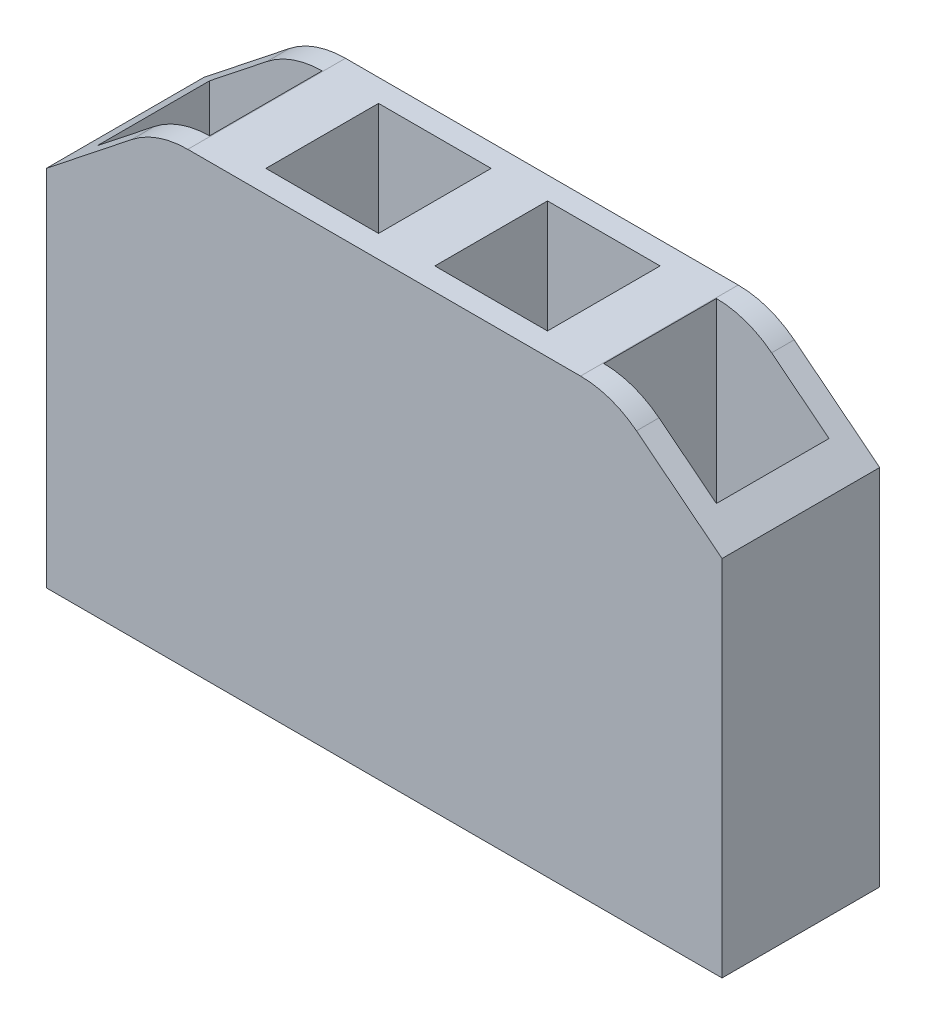
ISO-10303-21;
HEADER;
FILE_DESCRIPTION(('STEP AP214'),'2;1');
FILE_NAME('part.step','',(''),(''),'','','');
FILE_SCHEMA(('AUTOMOTIVE_DESIGN { 1 0 10303 214 1 1 1 1 }'));
ENDSEC;
DATA;
#1=APPLICATION_CONTEXT('core data for automotive mechanical design processes');
#2=APPLICATION_PROTOCOL_DEFINITION('international standard','automotive_design',2000,#1);
#3=PRODUCT_CONTEXT('',#1,'mechanical');
#4=PRODUCT('Part','Part','',(#3));
#5=PRODUCT_RELATED_PRODUCT_CATEGORY('part','',(#4));
#6=PRODUCT_DEFINITION_FORMATION('','',#4);
#7=PRODUCT_DEFINITION_CONTEXT('part definition',#1,'design');
#8=PRODUCT_DEFINITION('design','',#6,#7);
#9=PRODUCT_DEFINITION_SHAPE('','',#8);
#10=(LENGTH_UNIT() NAMED_UNIT(*) SI_UNIT(.MILLI.,.METRE.));
#11=(NAMED_UNIT(*) PLANE_ANGLE_UNIT() SI_UNIT($,.RADIAN.));
#12=(NAMED_UNIT(*) SI_UNIT($,.STERADIAN.) SOLID_ANGLE_UNIT());
#13=UNCERTAINTY_MEASURE_WITH_UNIT(LENGTH_MEASURE(1.E-05),#10,'distance_accuracy_value','');
#14=(GEOMETRIC_REPRESENTATION_CONTEXT(3) GLOBAL_UNCERTAINTY_ASSIGNED_CONTEXT((#13)) GLOBAL_UNIT_ASSIGNED_CONTEXT((#10,
#11,#12)) REPRESENTATION_CONTEXT('',''));
#15=CARTESIAN_POINT('',(0.,0.,0.));
#16=DIRECTION('',(0.,0.,1.));
#17=DIRECTION('',(1.,0.,0.));
#18=AXIS2_PLACEMENT_3D('',#15,#16,#17);
#19=CARTESIAN_POINT('',(7.5,10.,-1.75));
#20=DIRECTION('',(-1.,0.,0.));
#21=DIRECTION('',(0.,0.,1.));
#22=AXIS2_PLACEMENT_3D('',#19,#20,#21);
#23=PLANE('',#22);
#24=DIRECTION('',(0.,-1.,0.));
#25=VECTOR('',#24,1.);
#26=CARTESIAN_POINT('',(7.5,10.,-1.75));
#27=LINE('',#26,#25);
#28=CARTESIAN_POINT('',(7.5,8.06318739887953,-1.75));
#29=VERTEX_POINT('',#28);
#30=CARTESIAN_POINT('',(7.5,0.,-1.75));
#31=VERTEX_POINT('',#30);
#32=EDGE_CURVE('E371',#29,#31,#27,.T.);
#33=ORIENTED_EDGE('',*,*,#32,.F.);
#34=DIRECTION('',(0.,0.,-1.));
#35=VECTOR('',#34,1.);
#36=CARTESIAN_POINT('',(7.5,8.06318739887953,29.0804595902587));
#37=LINE('',#36,#35);
#38=CARTESIAN_POINT('',(7.5,8.06318739887953,1.75));
#39=VERTEX_POINT('',#38);
#40=EDGE_CURVE('E326',#39,#29,#37,.T.);
#41=ORIENTED_EDGE('',*,*,#40,.F.);
#42=DIRECTION('',(0.,-1.,0.));
#43=VECTOR('',#42,1.);
#44=CARTESIAN_POINT('',(7.5,10.,1.75));
#45=LINE('',#44,#43);
#46=CARTESIAN_POINT('',(7.5,0.,1.75));
#47=VERTEX_POINT('',#46);
#48=EDGE_CURVE('E355',#39,#47,#45,.T.);
#49=ORIENTED_EDGE('',*,*,#48,.T.);
#50=DIRECTION('',(0.,0.,-1.));
#51=VECTOR('',#50,1.);
#52=CARTESIAN_POINT('',(7.5,0.,-1.75));
#53=LINE('',#52,#51);
#54=EDGE_CURVE('E347',#47,#31,#53,.T.);
#55=ORIENTED_EDGE('',*,*,#54,.T.);
#56=EDGE_LOOP('',(#33,#41,#49,#55));
#57=FACE_BOUND('',#56,.T.);
#58=ADVANCED_FACE('F32',(#57),#23,.F.);
#59=CARTESIAN_POINT('',(-7.5,10.,-1.75));
#60=DIRECTION('',(0.,0.,1.));
#61=DIRECTION('',(1.,0.,0.));
#62=AXIS2_PLACEMENT_3D('',#59,#60,#61);
#63=PLANE('',#62);
#64=DIRECTION('',(-1.,0.,0.));
#65=VECTOR('',#64,1.);
#66=CARTESIAN_POINT('',(-7.5,10.,-1.75));
#67=LINE('',#66,#65);
#68=CARTESIAN_POINT('',(4.35886641335889,10.,-1.75));
#69=VERTEX_POINT('',#68);
#70=CARTESIAN_POINT('',(-4.35886641335889,10.,-1.75));
#71=VERTEX_POINT('',#70);
#72=EDGE_CURVE('E348',#69,#71,#67,.T.);
#73=ORIENTED_EDGE('',*,*,#72,.F.);
#74=CARTESIAN_POINT('',(4.35886641335889,8.,-1.75));
#75=DIRECTION('',(0.,0.,1.));
#76=DIRECTION('',(1.,0.,0.));
#77=AXIS2_PLACEMENT_3D('',#74,#75,#76);
#78=CIRCLE('',#77,2.);
#79=CARTESIAN_POINT('',(5.60075583173029,9.56770873332298,-1.75));
#80=VERTEX_POINT('',#79);
#81=EDGE_CURVE('E387',#69,#80,#78,.F.);
#82=ORIENTED_EDGE('',*,*,#81,.T.);
#83=DIRECTION('',(0.783854366661492,-0.620944709185699,0.));
#84=VECTOR('',#83,1.);
#85=CARTESIAN_POINT('',(-2.65912024884697,16.1109220761388,-1.75));
#86=LINE('',#85,#84);
#87=EDGE_CURVE('E340',#80,#29,#86,.T.);
#88=ORIENTED_EDGE('',*,*,#87,.T.);
#89=ORIENTED_EDGE('',*,*,#32,.T.);
#90=DIRECTION('',(-1.,0.,0.));
#91=VECTOR('',#90,1.);
#92=CARTESIAN_POINT('',(-7.5,0.,-1.75));
#93=LINE('',#92,#91);
#94=CARTESIAN_POINT('',(-7.5,0.,-1.75));
#95=VERTEX_POINT('',#94);
#96=EDGE_CURVE('E358',#31,#95,#93,.T.);
#97=ORIENTED_EDGE('',*,*,#96,.T.);
#98=DIRECTION('',(0.,-1.,0.));
#99=VECTOR('',#98,1.);
#100=CARTESIAN_POINT('',(-7.5,10.,-1.75));
#101=LINE('',#100,#99);
#102=CARTESIAN_POINT('',(-7.5,8.06318739887953,-1.75));
#103=VERTEX_POINT('',#102);
#104=EDGE_CURVE('E369',#103,#95,#101,.T.);
#105=ORIENTED_EDGE('',*,*,#104,.F.);
#106=DIRECTION('',(0.783854366661492,0.620944709185699,0.));
#107=VECTOR('',#106,1.);
#108=CARTESIAN_POINT('',(-6.55729477316736,8.80996874988045,-1.75));
#109=LINE('',#108,#107);
#110=CARTESIAN_POINT('',(-5.60075583173029,9.56770873332298,-1.75));
#111=VERTEX_POINT('',#110);
#112=EDGE_CURVE('E344',#103,#111,#109,.T.);
#113=ORIENTED_EDGE('',*,*,#112,.T.);
#114=CARTESIAN_POINT('',(-4.35886641335889,8.,-1.75));
#115=DIRECTION('',(0.,0.,1.));
#116=DIRECTION('',(1.,0.,0.));
#117=AXIS2_PLACEMENT_3D('',#114,#115,#116);
#118=CIRCLE('',#117,2.);
#119=EDGE_CURVE('E385',#111,#71,#118,.F.);
#120=ORIENTED_EDGE('',*,*,#119,.T.);
#121=EDGE_LOOP('',(#73,#82,#88,#89,#97,#105,#113,#120));
#122=FACE_BOUND('',#121,.T.);
#123=ADVANCED_FACE('F432',(#122),#63,.F.);
#124=CARTESIAN_POINT('',(-7.5,10.,-1.75));
#125=DIRECTION('',(1.,0.,0.));
#126=DIRECTION('',(0.,0.,-1.));
#127=AXIS2_PLACEMENT_3D('',#124,#125,#126);
#128=PLANE('',#127);
#129=DIRECTION('',(0.,-1.,0.));
#130=VECTOR('',#129,1.);
#131=CARTESIAN_POINT('',(-7.5,10.,1.75));
#132=LINE('',#131,#130);
#133=CARTESIAN_POINT('',(-7.5,8.06318739887953,1.75));
#134=VERTEX_POINT('',#133);
#135=CARTESIAN_POINT('',(-7.5,0.,1.75));
#136=VERTEX_POINT('',#135);
#137=EDGE_CURVE('E367',#134,#136,#132,.T.);
#138=ORIENTED_EDGE('',*,*,#137,.F.);
#139=DIRECTION('',(0.,0.,-1.));
#140=VECTOR('',#139,1.);
#141=CARTESIAN_POINT('',(-7.5,8.06318739887953,29.0804595902587));
#142=LINE('',#141,#140);
#143=EDGE_CURVE('E335',#134,#103,#142,.T.);
#144=ORIENTED_EDGE('',*,*,#143,.T.);
#145=ORIENTED_EDGE('',*,*,#104,.T.);
#146=DIRECTION('',(0.,0.,1.));
#147=VECTOR('',#146,1.);
#148=CARTESIAN_POINT('',(-7.5,0.,-1.75));
#149=LINE('',#148,#147);
#150=EDGE_CURVE('E361',#95,#136,#149,.T.);
#151=ORIENTED_EDGE('',*,*,#150,.T.);
#152=EDGE_LOOP('',(#138,#144,#145,#151));
#153=FACE_BOUND('',#152,.T.);
#154=ADVANCED_FACE('F440',(#153),#128,.F.);
#155=CARTESIAN_POINT('',(-7.5,10.,1.75));
#156=DIRECTION('',(0.,0.,-1.));
#157=DIRECTION('',(-1.,0.,0.));
#158=AXIS2_PLACEMENT_3D('',#155,#156,#157);
#159=PLANE('',#158);
#160=DIRECTION('',(-0.783854366661492,0.620944709185699,0.));
#161=VECTOR('',#160,1.);
#162=CARTESIAN_POINT('',(-2.65912024884697,16.1109220761388,1.75));
#163=LINE('',#162,#161);
#164=CARTESIAN_POINT('',(5.60075583173029,9.56770873332298,1.75));
#165=VERTEX_POINT('',#164);
#166=EDGE_CURVE('E337',#39,#165,#163,.T.);
#167=ORIENTED_EDGE('',*,*,#166,.T.);
#168=CARTESIAN_POINT('',(4.35886641335889,8.,1.75));
#169=DIRECTION('',(0.,0.,-1.));
#170=DIRECTION('',(-1.,0.,0.));
#171=AXIS2_PLACEMENT_3D('',#168,#169,#170);
#172=CIRCLE('',#171,2.);
#173=CARTESIAN_POINT('',(4.35886641335889,10.,1.75));
#174=VERTEX_POINT('',#173);
#175=EDGE_CURVE('E379',#165,#174,#172,.F.);
#176=ORIENTED_EDGE('',*,*,#175,.T.);
#177=DIRECTION('',(1.,0.,0.));
#178=VECTOR('',#177,1.);
#179=CARTESIAN_POINT('',(-7.5,10.,1.75));
#180=LINE('',#179,#178);
#181=CARTESIAN_POINT('',(-4.35886641335889,10.,1.75));
#182=VERTEX_POINT('',#181);
#183=EDGE_CURVE('E351',#182,#174,#180,.T.);
#184=ORIENTED_EDGE('',*,*,#183,.F.);
#185=CARTESIAN_POINT('',(-4.35886641335889,8.,1.75));
#186=DIRECTION('',(0.,0.,-1.));
#187=DIRECTION('',(-1.,0.,0.));
#188=AXIS2_PLACEMENT_3D('',#185,#186,#187);
#189=CIRCLE('',#188,2.);
#190=CARTESIAN_POINT('',(-5.60075583173029,9.56770873332298,1.75));
#191=VERTEX_POINT('',#190);
#192=EDGE_CURVE('E377',#182,#191,#189,.F.);
#193=ORIENTED_EDGE('',*,*,#192,.T.);
#194=DIRECTION('',(-0.783854366661492,-0.620944709185699,0.));
#195=VECTOR('',#194,1.);
#196=CARTESIAN_POINT('',(-6.55729477316736,8.80996874988045,1.75));
#197=LINE('',#196,#195);
#198=EDGE_CURVE('E342',#191,#134,#197,.T.);
#199=ORIENTED_EDGE('',*,*,#198,.T.);
#200=ORIENTED_EDGE('',*,*,#137,.T.);
#201=DIRECTION('',(1.,0.,0.));
#202=VECTOR('',#201,1.);
#203=CARTESIAN_POINT('',(-7.5,0.,1.75));
#204=LINE('',#203,#202);
#205=EDGE_CURVE('E352',#136,#47,#204,.T.);
#206=ORIENTED_EDGE('',*,*,#205,.T.);
#207=ORIENTED_EDGE('',*,*,#48,.F.);
#208=EDGE_LOOP('',(#167,#176,#184,#193,#199,#200,#206,#207));
#209=FACE_BOUND('',#208,.T.);
#210=ADVANCED_FACE('F423',(#209),#159,.F.);
#211=CARTESIAN_POINT('',(0.,10.,0.));
#212=DIRECTION('',(0.,1.,0.));
#213=DIRECTION('',(0.,0.,1.));
#214=AXIS2_PLACEMENT_3D('',#211,#212,#213);
#215=PLANE('',#214);
#216=DIRECTION('',(0.,0.,-1.));
#217=VECTOR('',#216,1.);
#218=CARTESIAN_POINT('',(3.125,10.,-1.25));
#219=LINE('',#218,#217);
#220=CARTESIAN_POINT('',(3.125,10.,1.25));
#221=VERTEX_POINT('',#220);
#222=CARTESIAN_POINT('',(3.125,10.,-1.25));
#223=VERTEX_POINT('',#222);
#224=EDGE_CURVE('E47',#221,#223,#219,.T.);
#225=ORIENTED_EDGE('',*,*,#224,.F.);
#226=DIRECTION('',(1.,0.,0.));
#227=VECTOR('',#226,1.);
#228=CARTESIAN_POINT('',(3.125,10.,1.25));
#229=LINE('',#228,#227);
#230=CARTESIAN_POINT('',(0.625,10.,1.25));
#231=VERTEX_POINT('',#230);
#232=EDGE_CURVE('E226',#231,#221,#229,.T.);
#233=ORIENTED_EDGE('',*,*,#232,.F.);
#234=DIRECTION('',(0.,0.,1.));
#235=VECTOR('',#234,1.);
#236=CARTESIAN_POINT('',(0.625,10.,-1.25));
#237=LINE('',#236,#235);
#238=CARTESIAN_POINT('',(0.625,10.,-1.25));
#239=VERTEX_POINT('',#238);
#240=EDGE_CURVE('E229',#239,#231,#237,.T.);
#241=ORIENTED_EDGE('',*,*,#240,.F.);
#242=DIRECTION('',(-1.,0.,0.));
#243=VECTOR('',#242,1.);
#244=CARTESIAN_POINT('',(3.125,10.,-1.25));
#245=LINE('',#244,#243);
#246=EDGE_CURVE('E235',#223,#239,#245,.T.);
#247=ORIENTED_EDGE('',*,*,#246,.F.);
#248=EDGE_LOOP('',(#225,#233,#241,#247));
#249=FACE_BOUND('',#248,.T.);
#250=DIRECTION('',(0.,0.,-1.));
#251=VECTOR('',#250,1.);
#252=CARTESIAN_POINT('',(-0.625,10.,-1.25));
#253=LINE('',#252,#251);
#254=CARTESIAN_POINT('',(-0.625,10.,1.25));
#255=VERTEX_POINT('',#254);
#256=CARTESIAN_POINT('',(-0.625,10.,-1.25));
#257=VERTEX_POINT('',#256);
#258=EDGE_CURVE('E300',#255,#257,#253,.T.);
#259=ORIENTED_EDGE('',*,*,#258,.F.);
#260=DIRECTION('',(1.,0.,0.));
#261=VECTOR('',#260,1.);
#262=CARTESIAN_POINT('',(-3.125,10.,1.25));
#263=LINE('',#262,#261);
#264=CARTESIAN_POINT('',(-3.125,10.,1.25));
#265=VERTEX_POINT('',#264);
#266=EDGE_CURVE('E305',#265,#255,#263,.T.);
#267=ORIENTED_EDGE('',*,*,#266,.F.);
#268=DIRECTION('',(0.,0.,1.));
#269=VECTOR('',#268,1.);
#270=CARTESIAN_POINT('',(-3.125,10.,-1.25));
#271=LINE('',#270,#269);
#272=CARTESIAN_POINT('',(-3.125,10.,-1.25));
#273=VERTEX_POINT('',#272);
#274=EDGE_CURVE('E319',#273,#265,#271,.T.);
#275=ORIENTED_EDGE('',*,*,#274,.F.);
#276=DIRECTION('',(-1.,0.,0.));
#277=VECTOR('',#276,1.);
#278=CARTESIAN_POINT('',(-3.125,10.,-1.25));
#279=LINE('',#278,#277);
#280=EDGE_CURVE('E316',#257,#273,#279,.T.);
#281=ORIENTED_EDGE('',*,*,#280,.F.);
#282=EDGE_LOOP('',(#259,#267,#275,#281));
#283=FACE_BOUND('',#282,.T.);
#284=ORIENTED_EDGE('',*,*,#183,.T.);
#285=DIRECTION('',(0.,0.,1.));
#286=VECTOR('',#285,1.);
#287=CARTESIAN_POINT('',(4.35886641335889,10.,-1.75));
#288=LINE('',#287,#286);
#289=EDGE_CURVE('E383',#174,#69,#288,.F.);
#290=ORIENTED_EDGE('',*,*,#289,.T.);
#291=ORIENTED_EDGE('',*,*,#72,.T.);
#292=DIRECTION('',(0.,0.,-1.));
#293=VECTOR('',#292,1.);
#294=CARTESIAN_POINT('',(-4.35886641335889,10.,1.75));
#295=LINE('',#294,#293);
#296=EDGE_CURVE('E381',#71,#182,#295,.F.);
#297=ORIENTED_EDGE('',*,*,#296,.T.);
#298=EDGE_LOOP('',(#284,#290,#291,#297));
#299=FACE_BOUND('',#298,.T.);
#300=ADVANCED_FACE('F454',(#249,#283,#299),#215,.T.);
#301=CARTESIAN_POINT('',(0.,0.,0.));
#302=DIRECTION('',(0.,1.,0.));
#303=DIRECTION('',(0.,0.,1.));
#304=AXIS2_PLACEMENT_3D('',#301,#302,#303);
#305=PLANE('',#304);
#306=ORIENTED_EDGE('',*,*,#54,.F.);
#307=ORIENTED_EDGE('',*,*,#205,.F.);
#308=ORIENTED_EDGE('',*,*,#150,.F.);
#309=ORIENTED_EDGE('',*,*,#96,.F.);
#310=EDGE_LOOP('',(#306,#307,#308,#309));
#311=FACE_BOUND('',#310,.T.);
#312=ADVANCED_FACE('F436',(#311),#305,.F.);
#313=CARTESIAN_POINT('',(7.5,8.06318739887953,29.0804595902587));
#314=DIRECTION('',(-0.620944709185699,-0.783854366661492,0.));
#315=DIRECTION('',(0.783854366661492,-0.620944709185699,0.));
#316=AXIS2_PLACEMENT_3D('',#313,#314,#315);
#317=PLANE('',#316);
#318=DIRECTION('',(0.,0.,1.));
#319=VECTOR('',#318,1.);
#320=CARTESIAN_POINT('',(6.875,8.55829268851895,29.0804595902587));
#321=LINE('',#320,#319);
#322=CARTESIAN_POINT('',(6.875,8.55829268851896,-1.25));
#323=VERTEX_POINT('',#322);
#324=CARTESIAN_POINT('',(6.875,8.55829268851896,1.25));
#325=VERTEX_POINT('',#324);
#326=EDGE_CURVE('E11',#323,#325,#321,.T.);
#327=ORIENTED_EDGE('',*,*,#326,.T.);
#328=DIRECTION('',(-0.783854366661492,0.620944709185699,0.));
#329=VECTOR('',#328,1.);
#330=CARTESIAN_POINT('',(7.5,8.06318739887953,1.25));
#331=LINE('',#330,#329);
#332=CARTESIAN_POINT('',(5.60075583173029,9.56770873332298,1.25));
#333=VERTEX_POINT('',#332);
#334=EDGE_CURVE('E268',#325,#333,#331,.T.);
#335=ORIENTED_EDGE('',*,*,#334,.T.);
#336=DIRECTION('',(0.,0.,1.));
#337=VECTOR('',#336,1.);
#338=CARTESIAN_POINT('',(5.60075583173029,9.56770873332298,1.75));
#339=LINE('',#338,#337);
#340=EDGE_CURVE('E373',#333,#165,#339,.T.);
#341=ORIENTED_EDGE('',*,*,#340,.T.);
#342=ORIENTED_EDGE('',*,*,#166,.F.);
#343=ORIENTED_EDGE('',*,*,#40,.T.);
#344=ORIENTED_EDGE('',*,*,#87,.F.);
#345=CARTESIAN_POINT('',(5.60075583173029,9.56770873332298,-1.25));
#346=VERTEX_POINT('',#345);
#347=EDGE_CURVE('E374',#80,#346,#339,.T.);
#348=ORIENTED_EDGE('',*,*,#347,.T.);
#349=DIRECTION('',(0.783854366661492,-0.620944709185699,0.));
#350=VECTOR('',#349,1.);
#351=CARTESIAN_POINT('',(7.5,8.06318739887953,-1.25));
#352=LINE('',#351,#350);
#353=EDGE_CURVE('E55',#346,#323,#352,.T.);
#354=ORIENTED_EDGE('',*,*,#353,.T.);
#355=EDGE_LOOP('',(#327,#335,#341,#342,#343,#344,#348,#354));
#356=FACE_BOUND('',#355,.T.);
#357=ADVANCED_FACE('F414',(#356),#317,.F.);
#358=CARTESIAN_POINT('',(-7.5,8.06318739887953,29.0804595902587));
#359=DIRECTION('',(0.620944709185699,-0.783854366661492,0.));
#360=DIRECTION('',(0.783854366661492,0.620944709185699,0.));
#361=AXIS2_PLACEMENT_3D('',#358,#359,#360);
#362=PLANE('',#361);
#363=DIRECTION('',(0.,0.,-1.));
#364=VECTOR('',#363,1.);
#365=CARTESIAN_POINT('',(-5.60075583173029,9.56770873332298,-1.75));
#366=LINE('',#365,#364);
#367=CARTESIAN_POINT('',(-5.60075583173029,9.56770873332298,1.25));
#368=VERTEX_POINT('',#367);
#369=EDGE_CURVE('E390',#191,#368,#366,.T.);
#370=ORIENTED_EDGE('',*,*,#369,.T.);
#371=DIRECTION('',(-0.783854366661492,-0.620944709185699,0.));
#372=VECTOR('',#371,1.);
#373=CARTESIAN_POINT('',(-7.5,8.06318739887953,1.25));
#374=LINE('',#373,#372);
#375=CARTESIAN_POINT('',(-6.875,8.55829268851895,1.25));
#376=VERTEX_POINT('',#375);
#377=EDGE_CURVE('E297',#368,#376,#374,.T.);
#378=ORIENTED_EDGE('',*,*,#377,.T.);
#379=DIRECTION('',(0.,0.,-1.));
#380=VECTOR('',#379,1.);
#381=CARTESIAN_POINT('',(-6.875,8.55829268851895,29.0804595902587));
#382=LINE('',#381,#380);
#383=CARTESIAN_POINT('',(-6.875,8.55829268851896,-1.25));
#384=VERTEX_POINT('',#383);
#385=EDGE_CURVE('E400',#376,#384,#382,.T.);
#386=ORIENTED_EDGE('',*,*,#385,.T.);
#387=DIRECTION('',(0.783854366661492,0.620944709185699,0.));
#388=VECTOR('',#387,1.);
#389=CARTESIAN_POINT('',(-7.5,8.06318739887953,-1.25));
#390=LINE('',#389,#388);
#391=CARTESIAN_POINT('',(-5.60075583173029,9.56770873332298,-1.25));
#392=VERTEX_POINT('',#391);
#393=EDGE_CURVE('E287',#384,#392,#390,.T.);
#394=ORIENTED_EDGE('',*,*,#393,.T.);
#395=EDGE_CURVE('E389',#392,#111,#366,.T.);
#396=ORIENTED_EDGE('',*,*,#395,.T.);
#397=ORIENTED_EDGE('',*,*,#112,.F.);
#398=ORIENTED_EDGE('',*,*,#143,.F.);
#399=ORIENTED_EDGE('',*,*,#198,.F.);
#400=EDGE_LOOP('',(#370,#378,#386,#394,#396,#397,#398,#399));
#401=FACE_BOUND('',#400,.T.);
#402=ADVANCED_FACE('F444',(#401),#362,.F.);
#403=CARTESIAN_POINT('',(4.35886641335889,8.,29.0804595902587));
#404=DIRECTION('',(0.,0.,-1.));
#405=DIRECTION('',(-1.,0.,0.));
#406=AXIS2_PLACEMENT_3D('',#403,#404,#405);
#407=CYLINDRICAL_SURFACE('',#406,2.);
#408=CARTESIAN_POINT('',(4.35886641335889,8.,1.25));
#409=DIRECTION('',(0.,0.,1.));
#410=DIRECTION('',(1.,0.,0.));
#411=AXIS2_PLACEMENT_3D('',#408,#409,#410);
#412=CIRCLE('',#411,2.);
#413=CARTESIAN_POINT('',(4.375,9.99993492578686,1.25));
#414=VERTEX_POINT('',#413);
#415=EDGE_CURVE('E40',#414,#333,#412,.F.);
#416=ORIENTED_EDGE('',*,*,#415,.F.);
#417=DIRECTION('',(0.,0.,-1.));
#418=VECTOR('',#417,1.);
#419=CARTESIAN_POINT('',(4.375,9.99993492578686,29.0804595902587));
#420=LINE('',#419,#418);
#421=CARTESIAN_POINT('',(4.375,9.99993492578686,-1.25));
#422=VERTEX_POINT('',#421);
#423=EDGE_CURVE('E405',#422,#414,#420,.F.);
#424=ORIENTED_EDGE('',*,*,#423,.F.);
#425=CARTESIAN_POINT('',(4.35886641335889,8.,-1.25));
#426=DIRECTION('',(0.,0.,-1.));
#427=DIRECTION('',(-1.,0.,0.));
#428=AXIS2_PLACEMENT_3D('',#425,#426,#427);
#429=CIRCLE('',#428,2.);
#430=EDGE_CURVE('E403',#346,#422,#429,.F.);
#431=ORIENTED_EDGE('',*,*,#430,.F.);
#432=ORIENTED_EDGE('',*,*,#347,.F.);
#433=ORIENTED_EDGE('',*,*,#81,.F.);
#434=ORIENTED_EDGE('',*,*,#289,.F.);
#435=ORIENTED_EDGE('',*,*,#175,.F.);
#436=ORIENTED_EDGE('',*,*,#340,.F.);
#437=EDGE_LOOP('',(#416,#424,#431,#432,#433,#434,#435,#436));
#438=FACE_BOUND('',#437,.T.);
#439=ADVANCED_FACE('F417',(#438),#407,.T.);
#440=CARTESIAN_POINT('',(-4.35886641335889,8.,29.0804595902587));
#441=DIRECTION('',(0.,0.,1.));
#442=DIRECTION('',(1.,0.,0.));
#443=AXIS2_PLACEMENT_3D('',#440,#441,#442);
#444=CYLINDRICAL_SURFACE('',#443,2.);
#445=CARTESIAN_POINT('',(-4.35886641335889,8.,1.25));
#446=DIRECTION('',(0.,0.,1.));
#447=DIRECTION('',(1.,0.,0.));
#448=AXIS2_PLACEMENT_3D('',#445,#446,#447);
#449=CIRCLE('',#448,2.);
#450=CARTESIAN_POINT('',(-4.375,9.99993492578686,1.25));
#451=VERTEX_POINT('',#450);
#452=EDGE_CURVE('E398',#368,#451,#449,.F.);
#453=ORIENTED_EDGE('',*,*,#452,.F.);
#454=ORIENTED_EDGE('',*,*,#369,.F.);
#455=ORIENTED_EDGE('',*,*,#192,.F.);
#456=ORIENTED_EDGE('',*,*,#296,.F.);
#457=ORIENTED_EDGE('',*,*,#119,.F.);
#458=ORIENTED_EDGE('',*,*,#395,.F.);
#459=CARTESIAN_POINT('',(-4.35886641335889,8.,-1.25));
#460=DIRECTION('',(0.,0.,-1.));
#461=DIRECTION('',(-1.,0.,0.));
#462=AXIS2_PLACEMENT_3D('',#459,#460,#461);
#463=CIRCLE('',#462,2.);
#464=CARTESIAN_POINT('',(-4.375,9.99993492578686,-1.25));
#465=VERTEX_POINT('',#464);
#466=EDGE_CURVE('E393',#465,#392,#463,.F.);
#467=ORIENTED_EDGE('',*,*,#466,.F.);
#468=DIRECTION('',(0.,0.,1.));
#469=VECTOR('',#468,1.);
#470=CARTESIAN_POINT('',(-4.375,9.99993492578686,29.0804595902587));
#471=LINE('',#470,#469);
#472=EDGE_CURVE('E395',#451,#465,#471,.F.);
#473=ORIENTED_EDGE('',*,*,#472,.F.);
#474=EDGE_LOOP('',(#453,#454,#455,#456,#457,#458,#467,#473));
#475=FACE_BOUND('',#474,.T.);
#476=ADVANCED_FACE('F34',(#475),#444,.T.);
#477=CARTESIAN_POINT('',(-0.625,2.,-1.25));
#478=DIRECTION('',(1.,0.,0.));
#479=DIRECTION('',(0.,0.,-1.));
#480=AXIS2_PLACEMENT_3D('',#477,#478,#479);
#481=PLANE('',#480);
#482=ORIENTED_EDGE('',*,*,#258,.T.);
#483=DIRECTION('',(0.,1.,0.));
#484=VECTOR('',#483,1.);
#485=CARTESIAN_POINT('',(-0.625,2.,-1.25));
#486=LINE('',#485,#484);
#487=CARTESIAN_POINT('',(-0.625,2.,-1.25));
#488=VERTEX_POINT('',#487);
#489=EDGE_CURVE('E314',#488,#257,#486,.T.);
#490=ORIENTED_EDGE('',*,*,#489,.F.);
#491=DIRECTION('',(0.,0.,-1.));
#492=VECTOR('',#491,1.);
#493=CARTESIAN_POINT('',(-0.625,2.,-1.25));
#494=LINE('',#493,#492);
#495=CARTESIAN_POINT('',(-0.625,2.,1.25));
#496=VERTEX_POINT('',#495);
#497=EDGE_CURVE('E301',#496,#488,#494,.T.);
#498=ORIENTED_EDGE('',*,*,#497,.F.);
#499=DIRECTION('',(0.,1.,0.));
#500=VECTOR('',#499,1.);
#501=CARTESIAN_POINT('',(-0.625,2.,1.25));
#502=LINE('',#501,#500);
#503=EDGE_CURVE('E324',#496,#255,#502,.T.);
#504=ORIENTED_EDGE('',*,*,#503,.T.);
#505=EDGE_LOOP('',(#482,#490,#498,#504));
#506=FACE_BOUND('',#505,.T.);
#507=ADVANCED_FACE('F493',(#506),#481,.F.);
#508=CARTESIAN_POINT('',(-3.125,2.,1.25));
#509=DIRECTION('',(0.,0.,1.));
#510=DIRECTION('',(1.,0.,0.));
#511=AXIS2_PLACEMENT_3D('',#508,#509,#510);
#512=PLANE('',#511);
#513=ORIENTED_EDGE('',*,*,#266,.T.);
#514=ORIENTED_EDGE('',*,*,#503,.F.);
#515=DIRECTION('',(1.,0.,0.));
#516=VECTOR('',#515,1.);
#517=CARTESIAN_POINT('',(-3.125,2.,1.25));
#518=LINE('',#517,#516);
#519=CARTESIAN_POINT('',(-3.125,2.,1.25));
#520=VERTEX_POINT('',#519);
#521=EDGE_CURVE('E311',#520,#496,#518,.T.);
#522=ORIENTED_EDGE('',*,*,#521,.F.);
#523=DIRECTION('',(0.,1.,0.));
#524=VECTOR('',#523,1.);
#525=CARTESIAN_POINT('',(-3.125,2.,1.25));
#526=LINE('',#525,#524);
#527=EDGE_CURVE('E327',#520,#265,#526,.T.);
#528=ORIENTED_EDGE('',*,*,#527,.T.);
#529=EDGE_LOOP('',(#513,#514,#522,#528));
#530=FACE_BOUND('',#529,.T.);
#531=ADVANCED_FACE('F551',(#530),#512,.F.);
#532=CARTESIAN_POINT('',(-3.125,2.,-1.25));
#533=DIRECTION('',(-1.,0.,0.));
#534=DIRECTION('',(0.,0.,1.));
#535=AXIS2_PLACEMENT_3D('',#532,#533,#534);
#536=PLANE('',#535);
#537=ORIENTED_EDGE('',*,*,#274,.T.);
#538=ORIENTED_EDGE('',*,*,#527,.F.);
#539=DIRECTION('',(0.,0.,1.));
#540=VECTOR('',#539,1.);
#541=CARTESIAN_POINT('',(-3.125,2.,-1.25));
#542=LINE('',#541,#540);
#543=CARTESIAN_POINT('',(-3.125,2.,-1.25));
#544=VERTEX_POINT('',#543);
#545=EDGE_CURVE('E308',#544,#520,#542,.T.);
#546=ORIENTED_EDGE('',*,*,#545,.F.);
#547=DIRECTION('',(0.,1.,0.));
#548=VECTOR('',#547,1.);
#549=CARTESIAN_POINT('',(-3.125,2.,-1.25));
#550=LINE('',#549,#548);
#551=EDGE_CURVE('E329',#544,#273,#550,.T.);
#552=ORIENTED_EDGE('',*,*,#551,.T.);
#553=EDGE_LOOP('',(#537,#538,#546,#552));
#554=FACE_BOUND('',#553,.T.);
#555=ADVANCED_FACE('F560',(#554),#536,.F.);
#556=CARTESIAN_POINT('',(-3.125,2.,-1.25));
#557=DIRECTION('',(0.,0.,-1.));
#558=DIRECTION('',(-1.,0.,0.));
#559=AXIS2_PLACEMENT_3D('',#556,#557,#558);
#560=PLANE('',#559);
#561=ORIENTED_EDGE('',*,*,#280,.T.);
#562=ORIENTED_EDGE('',*,*,#551,.F.);
#563=DIRECTION('',(-1.,0.,0.));
#564=VECTOR('',#563,1.);
#565=CARTESIAN_POINT('',(-3.125,2.,-1.25));
#566=LINE('',#565,#564);
#567=EDGE_CURVE('E304',#488,#544,#566,.T.);
#568=ORIENTED_EDGE('',*,*,#567,.F.);
#569=ORIENTED_EDGE('',*,*,#489,.T.);
#570=EDGE_LOOP('',(#561,#562,#568,#569));
#571=FACE_BOUND('',#570,.T.);
#572=ADVANCED_FACE('F570',(#571),#560,.F.);
#573=CARTESIAN_POINT('',(0.,2.,0.));
#574=DIRECTION('',(0.,1.,0.));
#575=DIRECTION('',(0.,0.,1.));
#576=AXIS2_PLACEMENT_3D('',#573,#574,#575);
#577=PLANE('',#576);
#578=ORIENTED_EDGE('',*,*,#497,.T.);
#579=ORIENTED_EDGE('',*,*,#567,.T.);
#580=ORIENTED_EDGE('',*,*,#545,.T.);
#581=ORIENTED_EDGE('',*,*,#521,.T.);
#582=EDGE_LOOP('',(#578,#579,#580,#581));
#583=FACE_BOUND('',#582,.T.);
#584=ADVANCED_FACE('F580',(#583),#577,.T.);
#585=CARTESIAN_POINT('',(-6.875,2.,-1.25));
#586=DIRECTION('',(-1.,0.,0.));
#587=DIRECTION('',(0.,0.,1.));
#588=AXIS2_PLACEMENT_3D('',#585,#586,#587);
#589=PLANE('',#588);
#590=DIRECTION('',(0.,1.,0.));
#591=VECTOR('',#590,1.);
#592=CARTESIAN_POINT('',(-6.875,2.,1.25));
#593=LINE('',#592,#591);
#594=CARTESIAN_POINT('',(-6.875,2.,1.25));
#595=VERTEX_POINT('',#594);
#596=EDGE_CURVE('E288',#595,#376,#593,.T.);
#597=ORIENTED_EDGE('',*,*,#596,.F.);
#598=DIRECTION('',(0.,0.,1.));
#599=VECTOR('',#598,1.);
#600=CARTESIAN_POINT('',(-6.875,2.,-1.25));
#601=LINE('',#600,#599);
#602=CARTESIAN_POINT('',(-6.875,2.,-1.25));
#603=VERTEX_POINT('',#602);
#604=EDGE_CURVE('E277',#603,#595,#601,.T.);
#605=ORIENTED_EDGE('',*,*,#604,.F.);
#606=DIRECTION('',(0.,1.,0.));
#607=VECTOR('',#606,1.);
#608=CARTESIAN_POINT('',(-6.875,2.,-1.25));
#609=LINE('',#608,#607);
#610=EDGE_CURVE('E291',#603,#384,#609,.T.);
#611=ORIENTED_EDGE('',*,*,#610,.T.);
#612=ORIENTED_EDGE('',*,*,#385,.F.);
#613=EDGE_LOOP('',(#597,#605,#611,#612));
#614=FACE_BOUND('',#613,.T.);
#615=ADVANCED_FACE('F462',(#614),#589,.F.);
#616=CARTESIAN_POINT('',(-6.875,2.,1.25));
#617=DIRECTION('',(0.,0.,1.));
#618=DIRECTION('',(1.,0.,0.));
#619=AXIS2_PLACEMENT_3D('',#616,#617,#618);
#620=PLANE('',#619);
#621=ORIENTED_EDGE('',*,*,#452,.T.);
#622=DIRECTION('',(0.,1.,0.));
#623=VECTOR('',#622,1.);
#624=CARTESIAN_POINT('',(-4.375,2.,1.25));
#625=LINE('',#624,#623);
#626=CARTESIAN_POINT('',(-4.375,2.,1.25));
#627=VERTEX_POINT('',#626);
#628=EDGE_CURVE('E284',#627,#451,#625,.T.);
#629=ORIENTED_EDGE('',*,*,#628,.F.);
#630=DIRECTION('',(1.,0.,0.));
#631=VECTOR('',#630,1.);
#632=CARTESIAN_POINT('',(-6.875,2.,1.25));
#633=LINE('',#632,#631);
#634=EDGE_CURVE('E280',#595,#627,#633,.T.);
#635=ORIENTED_EDGE('',*,*,#634,.F.);
#636=ORIENTED_EDGE('',*,*,#596,.T.);
#637=ORIENTED_EDGE('',*,*,#377,.F.);
#638=EDGE_LOOP('',(#621,#629,#635,#636,#637));
#639=FACE_BOUND('',#638,.T.);
#640=ADVANCED_FACE('F458',(#639),#620,.F.);
#641=CARTESIAN_POINT('',(-6.875,2.,-1.25));
#642=DIRECTION('',(0.,0.,-1.));
#643=DIRECTION('',(-1.,0.,0.));
#644=AXIS2_PLACEMENT_3D('',#641,#642,#643);
#645=PLANE('',#644);
#646=ORIENTED_EDGE('',*,*,#610,.F.);
#647=DIRECTION('',(-1.,0.,0.));
#648=VECTOR('',#647,1.);
#649=CARTESIAN_POINT('',(-6.875,2.,-1.25));
#650=LINE('',#649,#648);
#651=CARTESIAN_POINT('',(-4.375,2.,-1.25));
#652=VERTEX_POINT('',#651);
#653=EDGE_CURVE('E274',#652,#603,#650,.T.);
#654=ORIENTED_EDGE('',*,*,#653,.F.);
#655=DIRECTION('',(0.,1.,0.));
#656=VECTOR('',#655,1.);
#657=CARTESIAN_POINT('',(-4.375,2.,-1.25));
#658=LINE('',#657,#656);
#659=EDGE_CURVE('E283',#652,#465,#658,.T.);
#660=ORIENTED_EDGE('',*,*,#659,.T.);
#661=ORIENTED_EDGE('',*,*,#466,.T.);
#662=ORIENTED_EDGE('',*,*,#393,.F.);
#663=EDGE_LOOP('',(#646,#654,#660,#661,#662));
#664=FACE_BOUND('',#663,.T.);
#665=ADVANCED_FACE('F468',(#664),#645,.F.);
#666=CARTESIAN_POINT('',(-4.375,2.,-1.25));
#667=DIRECTION('',(1.,0.,0.));
#668=DIRECTION('',(0.,0.,-1.));
#669=AXIS2_PLACEMENT_3D('',#666,#667,#668);
#670=PLANE('',#669);
#671=ORIENTED_EDGE('',*,*,#472,.T.);
#672=ORIENTED_EDGE('',*,*,#659,.F.);
#673=DIRECTION('',(0.,0.,-1.));
#674=VECTOR('',#673,1.);
#675=CARTESIAN_POINT('',(-4.375,2.,-1.25));
#676=LINE('',#675,#674);
#677=EDGE_CURVE('E271',#627,#652,#676,.T.);
#678=ORIENTED_EDGE('',*,*,#677,.F.);
#679=ORIENTED_EDGE('',*,*,#628,.T.);
#680=EDGE_LOOP('',(#671,#672,#678,#679));
#681=FACE_BOUND('',#680,.T.);
#682=ADVANCED_FACE('F470',(#681),#670,.F.);
#683=CARTESIAN_POINT('',(0.,2.,0.));
#684=DIRECTION('',(0.,1.,0.));
#685=DIRECTION('',(0.,0.,1.));
#686=AXIS2_PLACEMENT_3D('',#683,#684,#685);
#687=PLANE('',#686);
#688=ORIENTED_EDGE('',*,*,#677,.T.);
#689=ORIENTED_EDGE('',*,*,#653,.T.);
#690=ORIENTED_EDGE('',*,*,#604,.T.);
#691=ORIENTED_EDGE('',*,*,#634,.T.);
#692=EDGE_LOOP('',(#688,#689,#690,#691));
#693=FACE_BOUND('',#692,.T.);
#694=ADVANCED_FACE('F464',(#693),#687,.T.);
#695=CARTESIAN_POINT('',(6.875,2.,-1.25));
#696=DIRECTION('',(1.,0.,0.));
#697=DIRECTION('',(0.,0.,-1.));
#698=AXIS2_PLACEMENT_3D('',#695,#696,#697);
#699=PLANE('',#698);
#700=DIRECTION('',(0.,1.,0.));
#701=VECTOR('',#700,1.);
#702=CARTESIAN_POINT('',(6.875,2.,-1.25));
#703=LINE('',#702,#701);
#704=CARTESIAN_POINT('',(6.875,2.,-1.25));
#705=VERTEX_POINT('',#704);
#706=EDGE_CURVE('E256',#705,#323,#703,.T.);
#707=ORIENTED_EDGE('',*,*,#706,.F.);
#708=DIRECTION('',(0.,0.,-1.));
#709=VECTOR('',#708,1.);
#710=CARTESIAN_POINT('',(6.875,2.,-1.25));
#711=LINE('',#710,#709);
#712=CARTESIAN_POINT('',(6.875,2.,1.25));
#713=VERTEX_POINT('',#712);
#714=EDGE_CURVE('E241',#713,#705,#711,.T.);
#715=ORIENTED_EDGE('',*,*,#714,.F.);
#716=DIRECTION('',(0.,1.,0.));
#717=VECTOR('',#716,1.);
#718=CARTESIAN_POINT('',(6.875,2.,1.25));
#719=LINE('',#718,#717);
#720=EDGE_CURVE('E257',#713,#325,#719,.T.);
#721=ORIENTED_EDGE('',*,*,#720,.T.);
#722=ORIENTED_EDGE('',*,*,#326,.F.);
#723=EDGE_LOOP('',(#707,#715,#721,#722));
#724=FACE_BOUND('',#723,.T.);
#725=ADVANCED_FACE('F477',(#724),#699,.F.);
#726=CARTESIAN_POINT('',(6.875,2.,1.25));
#727=DIRECTION('',(0.,0.,1.));
#728=DIRECTION('',(1.,0.,0.));
#729=AXIS2_PLACEMENT_3D('',#726,#727,#728);
#730=PLANE('',#729);
#731=ORIENTED_EDGE('',*,*,#720,.F.);
#732=DIRECTION('',(1.,0.,0.));
#733=VECTOR('',#732,1.);
#734=CARTESIAN_POINT('',(6.875,2.,1.25));
#735=LINE('',#734,#733);
#736=CARTESIAN_POINT('',(4.375,2.,1.25));
#737=VERTEX_POINT('',#736);
#738=EDGE_CURVE('E253',#737,#713,#735,.T.);
#739=ORIENTED_EDGE('',*,*,#738,.F.);
#740=DIRECTION('',(0.,1.,0.));
#741=VECTOR('',#740,1.);
#742=CARTESIAN_POINT('',(4.375,2.,1.25));
#743=LINE('',#742,#741);
#744=EDGE_CURVE('E260',#737,#414,#743,.T.);
#745=ORIENTED_EDGE('',*,*,#744,.T.);
#746=ORIENTED_EDGE('',*,*,#415,.T.);
#747=ORIENTED_EDGE('',*,*,#334,.F.);
#748=EDGE_LOOP('',(#731,#739,#745,#746,#747));
#749=FACE_BOUND('',#748,.T.);
#750=ADVANCED_FACE('F408',(#749),#730,.F.);
#751=CARTESIAN_POINT('',(6.875,2.,-1.25));
#752=DIRECTION('',(0.,0.,-1.));
#753=DIRECTION('',(-1.,0.,0.));
#754=AXIS2_PLACEMENT_3D('',#751,#752,#753);
#755=PLANE('',#754);
#756=ORIENTED_EDGE('',*,*,#430,.T.);
#757=DIRECTION('',(0.,1.,0.));
#758=VECTOR('',#757,1.);
#759=CARTESIAN_POINT('',(4.375,2.,-1.25));
#760=LINE('',#759,#758);
#761=CARTESIAN_POINT('',(4.375,2.,-1.25));
#762=VERTEX_POINT('',#761);
#763=EDGE_CURVE('E263',#762,#422,#760,.T.);
#764=ORIENTED_EDGE('',*,*,#763,.F.);
#765=DIRECTION('',(-1.,0.,0.));
#766=VECTOR('',#765,1.);
#767=CARTESIAN_POINT('',(6.875,2.,-1.25));
#768=LINE('',#767,#766);
#769=EDGE_CURVE('E247',#705,#762,#768,.T.);
#770=ORIENTED_EDGE('',*,*,#769,.F.);
#771=ORIENTED_EDGE('',*,*,#706,.T.);
#772=ORIENTED_EDGE('',*,*,#353,.F.);
#773=EDGE_LOOP('',(#756,#764,#770,#771,#772));
#774=FACE_BOUND('',#773,.T.);
#775=ADVANCED_FACE('F639',(#774),#755,.F.);
#776=CARTESIAN_POINT('',(4.375,2.,-1.25));
#777=DIRECTION('',(-1.,0.,0.));
#778=DIRECTION('',(0.,0.,1.));
#779=AXIS2_PLACEMENT_3D('',#776,#777,#778);
#780=PLANE('',#779);
#781=ORIENTED_EDGE('',*,*,#423,.T.);
#782=ORIENTED_EDGE('',*,*,#744,.F.);
#783=DIRECTION('',(0.,0.,1.));
#784=VECTOR('',#783,1.);
#785=CARTESIAN_POINT('',(4.375,2.,-1.25));
#786=LINE('',#785,#784);
#787=EDGE_CURVE('E250',#762,#737,#786,.T.);
#788=ORIENTED_EDGE('',*,*,#787,.F.);
#789=ORIENTED_EDGE('',*,*,#763,.T.);
#790=EDGE_LOOP('',(#781,#782,#788,#789));
#791=FACE_BOUND('',#790,.T.);
#792=ADVANCED_FACE('F648',(#791),#780,.F.);
#793=CARTESIAN_POINT('',(0.,2.,0.));
#794=DIRECTION('',(0.,-1.,0.));
#795=DIRECTION('',(0.,0.,-1.));
#796=AXIS2_PLACEMENT_3D('',#793,#794,#795);
#797=PLANE('',#796);
#798=ORIENTED_EDGE('',*,*,#714,.T.);
#799=ORIENTED_EDGE('',*,*,#769,.T.);
#800=ORIENTED_EDGE('',*,*,#787,.T.);
#801=ORIENTED_EDGE('',*,*,#738,.T.);
#802=EDGE_LOOP('',(#798,#799,#800,#801));
#803=FACE_BOUND('',#802,.T.);
#804=ADVANCED_FACE('F657',(#803),#797,.F.);
#805=CARTESIAN_POINT('',(3.125,2.,-1.25));
#806=DIRECTION('',(1.,0.,0.));
#807=DIRECTION('',(0.,0.,-1.));
#808=AXIS2_PLACEMENT_3D('',#805,#806,#807);
#809=PLANE('',#808);
#810=ORIENTED_EDGE('',*,*,#224,.T.);
#811=DIRECTION('',(0.,1.,0.));
#812=VECTOR('',#811,1.);
#813=CARTESIAN_POINT('',(3.125,2.,-1.25));
#814=LINE('',#813,#812);
#815=CARTESIAN_POINT('',(3.125,2.,-1.25));
#816=VERTEX_POINT('',#815);
#817=EDGE_CURVE('E204',#816,#223,#814,.T.);
#818=ORIENTED_EDGE('',*,*,#817,.F.);
#819=DIRECTION('',(0.,0.,-1.));
#820=VECTOR('',#819,1.);
#821=CARTESIAN_POINT('',(3.125,2.,-1.25));
#822=LINE('',#821,#820);
#823=CARTESIAN_POINT('',(3.125,2.,1.25));
#824=VERTEX_POINT('',#823);
#825=EDGE_CURVE('E208',#824,#816,#822,.T.);
#826=ORIENTED_EDGE('',*,*,#825,.F.);
#827=DIRECTION('',(0.,1.,0.));
#828=VECTOR('',#827,1.);
#829=CARTESIAN_POINT('',(3.125,2.,1.25));
#830=LINE('',#829,#828);
#831=EDGE_CURVE('E239',#824,#221,#830,.T.);
#832=ORIENTED_EDGE('',*,*,#831,.T.);
#833=EDGE_LOOP('',(#810,#818,#826,#832));
#834=FACE_BOUND('',#833,.T.);
#835=ADVANCED_FACE('F206',(#834),#809,.F.);
#836=CARTESIAN_POINT('',(3.125,2.,1.25));
#837=DIRECTION('',(0.,0.,1.));
#838=DIRECTION('',(1.,0.,0.));
#839=AXIS2_PLACEMENT_3D('',#836,#837,#838);
#840=PLANE('',#839);
#841=ORIENTED_EDGE('',*,*,#232,.T.);
#842=ORIENTED_EDGE('',*,*,#831,.F.);
#843=DIRECTION('',(1.,0.,0.));
#844=VECTOR('',#843,1.);
#845=CARTESIAN_POINT('',(3.125,2.,1.25));
#846=LINE('',#845,#844);
#847=CARTESIAN_POINT('',(0.625,2.,1.25));
#848=VERTEX_POINT('',#847);
#849=EDGE_CURVE('E214',#848,#824,#846,.T.);
#850=ORIENTED_EDGE('',*,*,#849,.F.);
#851=DIRECTION('',(0.,1.,0.));
#852=VECTOR('',#851,1.);
#853=CARTESIAN_POINT('',(0.625,2.,1.25));
#854=LINE('',#853,#852);
#855=EDGE_CURVE('E242',#848,#231,#854,.T.);
#856=ORIENTED_EDGE('',*,*,#855,.T.);
#857=EDGE_LOOP('',(#841,#842,#850,#856));
#858=FACE_BOUND('',#857,.T.);
#859=ADVANCED_FACE('F676',(#858),#840,.F.);
#860=CARTESIAN_POINT('',(0.625,2.,-1.25));
#861=DIRECTION('',(-1.,0.,0.));
#862=DIRECTION('',(0.,0.,1.));
#863=AXIS2_PLACEMENT_3D('',#860,#861,#862);
#864=PLANE('',#863);
#865=ORIENTED_EDGE('',*,*,#240,.T.);
#866=ORIENTED_EDGE('',*,*,#855,.F.);
#867=DIRECTION('',(0.,0.,1.));
#868=VECTOR('',#867,1.);
#869=CARTESIAN_POINT('',(0.625,2.,-1.25));
#870=LINE('',#869,#868);
#871=CARTESIAN_POINT('',(0.625,2.,-1.25));
#872=VERTEX_POINT('',#871);
#873=EDGE_CURVE('E222',#872,#848,#870,.T.);
#874=ORIENTED_EDGE('',*,*,#873,.F.);
#875=DIRECTION('',(0.,1.,0.));
#876=VECTOR('',#875,1.);
#877=CARTESIAN_POINT('',(0.625,2.,-1.25));
#878=LINE('',#877,#876);
#879=EDGE_CURVE('E213',#872,#239,#878,.T.);
#880=ORIENTED_EDGE('',*,*,#879,.T.);
#881=EDGE_LOOP('',(#865,#866,#874,#880));
#882=FACE_BOUND('',#881,.T.);
#883=ADVANCED_FACE('F685',(#882),#864,.F.);
#884=CARTESIAN_POINT('',(3.125,2.,-1.25));
#885=DIRECTION('',(0.,0.,-1.));
#886=DIRECTION('',(-1.,0.,0.));
#887=AXIS2_PLACEMENT_3D('',#884,#885,#886);
#888=PLANE('',#887);
#889=ORIENTED_EDGE('',*,*,#246,.T.);
#890=ORIENTED_EDGE('',*,*,#879,.F.);
#891=DIRECTION('',(-1.,0.,0.));
#892=VECTOR('',#891,1.);
#893=CARTESIAN_POINT('',(3.125,2.,-1.25));
#894=LINE('',#893,#892);
#895=EDGE_CURVE('E217',#816,#872,#894,.T.);
#896=ORIENTED_EDGE('',*,*,#895,.F.);
#897=ORIENTED_EDGE('',*,*,#817,.T.);
#898=EDGE_LOOP('',(#889,#890,#896,#897));
#899=FACE_BOUND('',#898,.T.);
#900=ADVANCED_FACE('F218',(#899),#888,.F.);
#901=CARTESIAN_POINT('',(0.,2.,0.));
#902=DIRECTION('',(0.,-1.,0.));
#903=DIRECTION('',(0.,0.,-1.));
#904=AXIS2_PLACEMENT_3D('',#901,#902,#903);
#905=PLANE('',#904);
#906=ORIENTED_EDGE('',*,*,#825,.T.);
#907=ORIENTED_EDGE('',*,*,#895,.T.);
#908=ORIENTED_EDGE('',*,*,#873,.T.);
#909=ORIENTED_EDGE('',*,*,#849,.T.);
#910=EDGE_LOOP('',(#906,#907,#908,#909));
#911=FACE_BOUND('',#910,.T.);
#912=ADVANCED_FACE('F224',(#911),#905,.F.);
#913=CLOSED_SHELL('',(#58,#123,#154,#210,#300,#312,#357,#402,#439,#476,#507,#531,#555,#572,#584,
#615,#640,#665,#682,#694,#725,#750,#775,#792,#804,#835,#859,#883,#900,#912));
#914=MANIFOLD_SOLID_BREP('B2',#913);
#915=ADVANCED_BREP_SHAPE_REPRESENTATION('',(#18,#914),#14);
#916=SHAPE_DEFINITION_REPRESENTATION(#9,#915);
ENDSEC;
END-ISO-10303-21;
